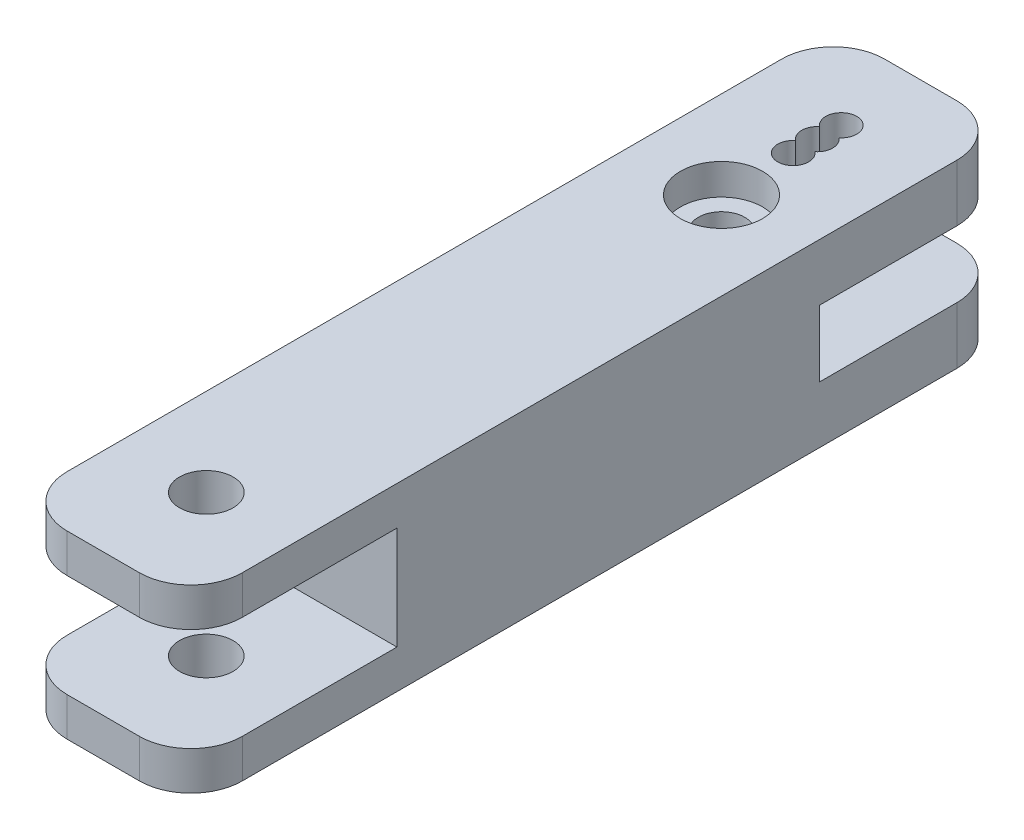
ISO-10303-21;
HEADER;
FILE_DESCRIPTION(('STEP AP214'),'2;1');
FILE_NAME('part.step','',(''),(''),'','','');
FILE_SCHEMA(('AUTOMOTIVE_DESIGN { 1 0 10303 214 1 1 1 1 }'));
ENDSEC;
DATA;
#1=APPLICATION_CONTEXT('core data for automotive mechanical design processes');
#2=APPLICATION_PROTOCOL_DEFINITION('international standard','automotive_design',2000,#1);
#3=PRODUCT_CONTEXT('',#1,'mechanical');
#4=PRODUCT('Part','Part','',(#3));
#5=PRODUCT_RELATED_PRODUCT_CATEGORY('part','',(#4));
#6=PRODUCT_DEFINITION_FORMATION('','',#4);
#7=PRODUCT_DEFINITION_CONTEXT('part definition',#1,'design');
#8=PRODUCT_DEFINITION('design','',#6,#7);
#9=PRODUCT_DEFINITION_SHAPE('','',#8);
#10=(LENGTH_UNIT() NAMED_UNIT(*) SI_UNIT(.MILLI.,.METRE.));
#11=(NAMED_UNIT(*) PLANE_ANGLE_UNIT() SI_UNIT($,.RADIAN.));
#12=(NAMED_UNIT(*) SI_UNIT($,.STERADIAN.) SOLID_ANGLE_UNIT());
#13=UNCERTAINTY_MEASURE_WITH_UNIT(LENGTH_MEASURE(1.E-05),#10,'distance_accuracy_value','');
#14=(GEOMETRIC_REPRESENTATION_CONTEXT(3) GLOBAL_UNCERTAINTY_ASSIGNED_CONTEXT((#13)) GLOBAL_UNIT_ASSIGNED_CONTEXT((#10,
#11,#12)) REPRESENTATION_CONTEXT('',''));
#15=CARTESIAN_POINT('',(0.,0.,0.));
#16=DIRECTION('',(0.,0.,1.));
#17=DIRECTION('',(1.,0.,0.));
#18=AXIS2_PLACEMENT_3D('',#15,#16,#17);
#19=CARTESIAN_POINT('',(0.,17.5,0.));
#20=DIRECTION('',(0.,0.,-1.));
#21=DIRECTION('',(-1.,0.,0.));
#22=AXIS2_PLACEMENT_3D('',#19,#20,#21);
#23=PLANE('',#22);
#24=DIRECTION('',(0.,-1.,0.));
#25=VECTOR('',#24,1.);
#26=CARTESIAN_POINT('',(12.,17.5,0.));
#27=LINE('',#26,#25);
#28=CARTESIAN_POINT('',(12.,0.,0.));
#29=VERTEX_POINT('',#28);
#30=CARTESIAN_POINT('',(12.,3.75,0.));
#31=VERTEX_POINT('',#30);
#32=EDGE_CURVE('E493',#29,#31,#27,.F.);
#33=ORIENTED_EDGE('',*,*,#32,.T.);
#34=DIRECTION('',(-1.,0.,0.));
#35=VECTOR('',#34,1.);
#36=CARTESIAN_POINT('',(0.,3.75,0.));
#37=LINE('',#36,#35);
#38=CARTESIAN_POINT('',(5.,3.75,0.));
#39=VERTEX_POINT('',#38);
#40=EDGE_CURVE('E372',#31,#39,#37,.T.);
#41=ORIENTED_EDGE('',*,*,#40,.T.);
#42=DIRECTION('',(0.,-1.,0.));
#43=VECTOR('',#42,1.);
#44=CARTESIAN_POINT('',(5.,17.5,0.));
#45=LINE('',#44,#43);
#46=CARTESIAN_POINT('',(5.,0.,0.));
#47=VERTEX_POINT('',#46);
#48=EDGE_CURVE('E497',#39,#47,#45,.T.);
#49=ORIENTED_EDGE('',*,*,#48,.T.);
#50=DIRECTION('',(1.,0.,0.));
#51=VECTOR('',#50,1.);
#52=CARTESIAN_POINT('',(0.,0.,0.));
#53=LINE('',#52,#51);
#54=EDGE_CURVE('E482',#47,#29,#53,.T.);
#55=ORIENTED_EDGE('',*,*,#54,.T.);
#56=EDGE_LOOP('',(#33,#41,#49,#55));
#57=FACE_BOUND('',#56,.T.);
#58=ADVANCED_FACE('F49',(#57),#23,.F.);
#59=CARTESIAN_POINT('',(0.,17.5,-79.3333));
#60=DIRECTION('',(0.,0.,1.));
#61=DIRECTION('',(1.,0.,0.));
#62=AXIS2_PLACEMENT_3D('',#59,#60,#61);
#63=PLANE('',#62);
#64=DIRECTION('',(0.,-1.,0.));
#65=VECTOR('',#64,1.);
#66=CARTESIAN_POINT('',(5.,17.5,-79.3333));
#67=LINE('',#66,#65);
#68=CARTESIAN_POINT('',(5.,0.,-79.3333));
#69=VERTEX_POINT('',#68);
#70=CARTESIAN_POINT('',(5.,5.525,-79.3333));
#71=VERTEX_POINT('',#70);
#72=EDGE_CURVE('E546',#69,#71,#67,.F.);
#73=ORIENTED_EDGE('',*,*,#72,.T.);
#74=DIRECTION('',(1.,0.,0.));
#75=VECTOR('',#74,1.);
#76=CARTESIAN_POINT('',(0.,5.525,-79.3333));
#77=LINE('',#76,#75);
#78=CARTESIAN_POINT('',(12.,5.525,-79.3333));
#79=VERTEX_POINT('',#78);
#80=EDGE_CURVE('E344',#71,#79,#77,.T.);
#81=ORIENTED_EDGE('',*,*,#80,.T.);
#82=DIRECTION('',(0.,-1.,0.));
#83=VECTOR('',#82,1.);
#84=CARTESIAN_POINT('',(12.,17.5,-79.3333));
#85=LINE('',#84,#83);
#86=CARTESIAN_POINT('',(12.,0.,-79.3333));
#87=VERTEX_POINT('',#86);
#88=EDGE_CURVE('E550',#79,#87,#85,.T.);
#89=ORIENTED_EDGE('',*,*,#88,.T.);
#90=DIRECTION('',(-1.,0.,0.));
#91=VECTOR('',#90,1.);
#92=CARTESIAN_POINT('',(0.,0.,-79.3333));
#93=LINE('',#92,#91);
#94=EDGE_CURVE('E466',#87,#69,#93,.T.);
#95=ORIENTED_EDGE('',*,*,#94,.T.);
#96=EDGE_LOOP('',(#73,#81,#89,#95));
#97=FACE_BOUND('',#96,.T.);
#98=ADVANCED_FACE('F626',(#97),#63,.F.);
#99=CARTESIAN_POINT('',(8.5,17.5,-10.));
#100=DIRECTION('',(0.,-1.,0.));
#101=DIRECTION('',(0.,0.,-1.));
#102=AXIS2_PLACEMENT_3D('',#99,#100,#101);
#103=CYLINDRICAL_SURFACE('',#102,2.6);
#104=CARTESIAN_POINT('',(8.5,3.75,-10.));
#105=DIRECTION('',(0.,-1.,0.));
#106=DIRECTION('',(0.,0.,-1.));
#107=AXIS2_PLACEMENT_3D('',#104,#105,#106);
#108=CIRCLE('',#107,2.6);
#109=CARTESIAN_POINT('',(8.5,3.75,-12.6));
#110=VERTEX_POINT('',#109);
#111=EDGE_CURVE('E379',#110,#110,#108,.T.);
#112=ORIENTED_EDGE('',*,*,#111,.F.);
#113=EDGE_LOOP('',(#112));
#114=FACE_BOUND('',#113,.T.);
#115=CARTESIAN_POINT('',(8.5,0.,-10.));
#116=DIRECTION('',(0.,1.,0.));
#117=DIRECTION('',(0.,0.,1.));
#118=AXIS2_PLACEMENT_3D('',#115,#116,#117);
#119=CIRCLE('',#118,2.6);
#120=CARTESIAN_POINT('',(8.5,0.,-7.4));
#121=VERTEX_POINT('',#120);
#122=EDGE_CURVE('E452',#121,#121,#119,.T.);
#123=ORIENTED_EDGE('',*,*,#122,.F.);
#124=EDGE_LOOP('',(#123));
#125=FACE_BOUND('',#124,.T.);
#126=ADVANCED_FACE('F620',(#114,#125),#103,.F.);
#127=CARTESIAN_POINT('',(8.45701186783815,17.5,-69.3332010002192));
#128=DIRECTION('',(0.,-1.,0.));
#129=DIRECTION('',(0.,0.,-1.));
#130=AXIS2_PLACEMENT_3D('',#127,#128,#129);
#131=CYLINDRICAL_SURFACE('',#130,1.50000000000001);
#132=CARTESIAN_POINT('',(8.45701186783815,5.525,-69.3332010002192));
#133=DIRECTION('',(0.,-1.,0.));
#134=DIRECTION('',(0.,0.,-1.));
#135=AXIS2_PLACEMENT_3D('',#132,#133,#134);
#136=CIRCLE('',#135,1.50000000000001);
#137=CARTESIAN_POINT('',(9.39982111565965,5.525,-70.4998675002193));
#138=VERTEX_POINT('',#137);
#139=CARTESIAN_POINT('',(9.39982111565966,5.525,-68.1665345002192));
#140=VERTEX_POINT('',#139);
#141=EDGE_CURVE('E65',#138,#140,#136,.T.);
#142=ORIENTED_EDGE('',*,*,#141,.F.);
#143=DIRECTION('',(0.,-1.,0.));
#144=VECTOR('',#143,1.);
#145=CARTESIAN_POINT('',(9.39982111565965,17.5,-70.4998675002193));
#146=LINE('',#145,#144);
#147=CARTESIAN_POINT('',(9.39982111565965,0.,-70.4998675002193));
#148=VERTEX_POINT('',#147);
#149=EDGE_CURVE('E447',#138,#148,#146,.T.);
#150=ORIENTED_EDGE('',*,*,#149,.T.);
#151=CARTESIAN_POINT('',(8.45701186783815,0.,-69.3332010002192));
#152=DIRECTION('',(0.,1.,0.));
#153=DIRECTION('',(0.,0.,1.));
#154=AXIS2_PLACEMENT_3D('',#151,#152,#153);
#155=CIRCLE('',#154,1.50000000000001);
#156=CARTESIAN_POINT('',(9.39982111565966,0.,-68.1665345002192));
#157=VERTEX_POINT('',#156);
#158=EDGE_CURVE('E400',#157,#148,#155,.T.);
#159=ORIENTED_EDGE('',*,*,#158,.F.);
#160=DIRECTION('',(0.,-1.,0.));
#161=VECTOR('',#160,1.);
#162=CARTESIAN_POINT('',(9.39982111565966,17.5,-68.1665345002192));
#163=LINE('',#162,#161);
#164=EDGE_CURVE('E418',#140,#157,#163,.T.);
#165=ORIENTED_EDGE('',*,*,#164,.F.);
#166=EDGE_LOOP('',(#142,#150,#159,#165));
#167=FACE_BOUND('',#166,.T.);
#168=ADVANCED_FACE('F595',(#167),#131,.F.);
#169=CARTESIAN_POINT('',(8.45701186783815,17.5,-71.6665340002192));
#170=DIRECTION('',(0.,-1.,0.));
#171=DIRECTION('',(0.,0.,-1.));
#172=AXIS2_PLACEMENT_3D('',#169,#170,#171);
#173=CYLINDRICAL_SURFACE('',#172,1.5);
#174=CARTESIAN_POINT('',(8.45701186783815,5.525,-71.6665340002192));
#175=DIRECTION('',(0.,-1.,0.));
#176=DIRECTION('',(0.,0.,-1.));
#177=AXIS2_PLACEMENT_3D('',#174,#175,#176);
#178=CIRCLE('',#177,1.5);
#179=CARTESIAN_POINT('',(7.51420262001665,5.525,-70.4998675002192));
#180=VERTEX_POINT('',#179);
#181=EDGE_CURVE('E357',#180,#138,#178,.T.);
#182=ORIENTED_EDGE('',*,*,#181,.F.);
#183=DIRECTION('',(0.,-1.,0.));
#184=VECTOR('',#183,1.);
#185=CARTESIAN_POINT('',(7.51420262001665,17.5,-70.4998675002192));
#186=LINE('',#185,#184);
#187=CARTESIAN_POINT('',(7.51420262001665,0.,-70.4998675002192));
#188=VERTEX_POINT('',#187);
#189=EDGE_CURVE('E442',#180,#188,#186,.T.);
#190=ORIENTED_EDGE('',*,*,#189,.T.);
#191=CARTESIAN_POINT('',(8.45701186783815,0.,-71.6665340002192));
#192=DIRECTION('',(0.,1.,0.));
#193=DIRECTION('',(0.,0.,1.));
#194=AXIS2_PLACEMENT_3D('',#191,#192,#193);
#195=CIRCLE('',#194,1.5);
#196=EDGE_CURVE('E422',#148,#188,#195,.T.);
#197=ORIENTED_EDGE('',*,*,#196,.F.);
#198=ORIENTED_EDGE('',*,*,#149,.F.);
#199=EDGE_LOOP('',(#182,#190,#197,#198));
#200=FACE_BOUND('',#199,.T.);
#201=ADVANCED_FACE('F610',(#200),#173,.F.);
#202=CARTESIAN_POINT('',(8.45701186783815,17.5,-69.3332010002192));
#203=DIRECTION('',(0.,-1.,0.));
#204=DIRECTION('',(0.,0.,-1.));
#205=AXIS2_PLACEMENT_3D('',#202,#203,#204);
#206=CYLINDRICAL_SURFACE('',#205,1.50000000000001);
#207=CARTESIAN_POINT('',(8.45701186783815,5.525,-69.3332010002192));
#208=DIRECTION('',(0.,-1.,0.));
#209=DIRECTION('',(0.,0.,-1.));
#210=AXIS2_PLACEMENT_3D('',#207,#208,#209);
#211=CIRCLE('',#210,1.50000000000001);
#212=CARTESIAN_POINT('',(7.51420262001665,5.525,-68.1665345002192));
#213=VERTEX_POINT('',#212);
#214=EDGE_CURVE('E354',#213,#180,#211,.T.);
#215=ORIENTED_EDGE('',*,*,#214,.F.);
#216=DIRECTION('',(0.,-1.,0.));
#217=VECTOR('',#216,1.);
#218=CARTESIAN_POINT('',(7.51420262001665,17.5,-68.1665345002192));
#219=LINE('',#218,#217);
#220=CARTESIAN_POINT('',(7.51420262001665,0.,-68.1665345002192));
#221=VERTEX_POINT('',#220);
#222=EDGE_CURVE('E437',#213,#221,#219,.T.);
#223=ORIENTED_EDGE('',*,*,#222,.T.);
#224=CARTESIAN_POINT('',(8.45701186783815,0.,-69.3332010002192));
#225=DIRECTION('',(0.,1.,0.));
#226=DIRECTION('',(0.,0.,1.));
#227=AXIS2_PLACEMENT_3D('',#224,#225,#226);
#228=CIRCLE('',#227,1.50000000000001);
#229=EDGE_CURVE('E426',#188,#221,#228,.T.);
#230=ORIENTED_EDGE('',*,*,#229,.F.);
#231=ORIENTED_EDGE('',*,*,#189,.F.);
#232=EDGE_LOOP('',(#215,#223,#230,#231));
#233=FACE_BOUND('',#232,.T.);
#234=ADVANCED_FACE('F605',(#233),#206,.F.);
#235=CARTESIAN_POINT('',(8.45701186783815,17.5,-66.9998680002192));
#236=DIRECTION('',(0.,-1.,0.));
#237=DIRECTION('',(0.,0.,-1.));
#238=AXIS2_PLACEMENT_3D('',#235,#236,#237);
#239=CYLINDRICAL_SURFACE('',#238,1.5);
#240=CARTESIAN_POINT('',(8.45701186783815,5.525,-66.9998680002192));
#241=DIRECTION('',(0.,-1.,0.));
#242=DIRECTION('',(0.,0.,-1.));
#243=AXIS2_PLACEMENT_3D('',#240,#241,#242);
#244=CIRCLE('',#243,1.5);
#245=EDGE_CURVE('E351',#140,#213,#244,.T.);
#246=ORIENTED_EDGE('',*,*,#245,.F.);
#247=ORIENTED_EDGE('',*,*,#164,.T.);
#248=CARTESIAN_POINT('',(8.45701186783815,0.,-66.9998680002192));
#249=DIRECTION('',(0.,1.,0.));
#250=DIRECTION('',(0.,0.,1.));
#251=AXIS2_PLACEMENT_3D('',#248,#249,#250);
#252=CIRCLE('',#251,1.5);
#253=EDGE_CURVE('E408',#221,#157,#252,.T.);
#254=ORIENTED_EDGE('',*,*,#253,.F.);
#255=ORIENTED_EDGE('',*,*,#222,.F.);
#256=EDGE_LOOP('',(#246,#247,#254,#255));
#257=FACE_BOUND('',#256,.T.);
#258=ADVANCED_FACE('F592',(#257),#239,.F.);
#259=CARTESIAN_POINT('',(5.,17.5,-5.));
#260=DIRECTION('',(0.,-1.,0.));
#261=DIRECTION('',(0.,0.,-1.));
#262=AXIS2_PLACEMENT_3D('',#259,#260,#261);
#263=CYLINDRICAL_SURFACE('',#262,5.);
#264=CARTESIAN_POINT('',(5.,3.75,-5.));
#265=DIRECTION('',(0.,-1.,0.));
#266=DIRECTION('',(0.,0.,-1.));
#267=AXIS2_PLACEMENT_3D('',#264,#265,#266);
#268=CIRCLE('',#267,5.);
#269=CARTESIAN_POINT('',(0.,3.75,-5.));
#270=VERTEX_POINT('',#269);
#271=EDGE_CURVE('E376',#270,#39,#268,.F.);
#272=ORIENTED_EDGE('',*,*,#271,.F.);
#273=DIRECTION('',(0.,-1.,0.));
#274=VECTOR('',#273,1.);
#275=CARTESIAN_POINT('',(0.,17.5,-5.));
#276=LINE('',#275,#274);
#277=CARTESIAN_POINT('',(0.,0.,-5.));
#278=VERTEX_POINT('',#277);
#279=EDGE_CURVE('E520',#278,#270,#276,.F.);
#280=ORIENTED_EDGE('',*,*,#279,.F.);
#281=CARTESIAN_POINT('',(5.,0.,-5.));
#282=DIRECTION('',(0.,-1.,0.));
#283=DIRECTION('',(0.,0.,-1.));
#284=AXIS2_PLACEMENT_3D('',#281,#282,#283);
#285=CIRCLE('',#284,5.);
#286=EDGE_CURVE('E511',#47,#278,#285,.T.);
#287=ORIENTED_EDGE('',*,*,#286,.F.);
#288=ORIENTED_EDGE('',*,*,#48,.F.);
#289=EDGE_LOOP('',(#272,#280,#287,#288));
#290=FACE_BOUND('',#289,.T.);
#291=ADVANCED_FACE('F657',(#290),#263,.T.);
#292=CARTESIAN_POINT('',(12.,17.5,-5.));
#293=DIRECTION('',(0.,-1.,0.));
#294=DIRECTION('',(0.,0.,-1.));
#295=AXIS2_PLACEMENT_3D('',#292,#293,#294);
#296=CYLINDRICAL_SURFACE('',#295,5.);
#297=CARTESIAN_POINT('',(12.,3.75,-5.));
#298=DIRECTION('',(0.,-1.,0.));
#299=DIRECTION('',(0.,0.,-1.));
#300=AXIS2_PLACEMENT_3D('',#297,#298,#299);
#301=CIRCLE('',#300,5.);
#302=CARTESIAN_POINT('',(17.,3.75,-5.));
#303=VERTEX_POINT('',#302);
#304=EDGE_CURVE('E12',#31,#303,#301,.F.);
#305=ORIENTED_EDGE('',*,*,#304,.F.);
#306=ORIENTED_EDGE('',*,*,#32,.F.);
#307=CARTESIAN_POINT('',(12.,0.,-5.));
#308=DIRECTION('',(0.,-1.,0.));
#309=DIRECTION('',(0.,0.,-1.));
#310=AXIS2_PLACEMENT_3D('',#307,#308,#309);
#311=CIRCLE('',#310,5.);
#312=CARTESIAN_POINT('',(17.,0.,-5.));
#313=VERTEX_POINT('',#312);
#314=EDGE_CURVE('E508',#313,#29,#311,.T.);
#315=ORIENTED_EDGE('',*,*,#314,.F.);
#316=DIRECTION('',(0.,-1.,0.));
#317=VECTOR('',#316,1.);
#318=CARTESIAN_POINT('',(17.,17.5,-5.));
#319=LINE('',#318,#317);
#320=EDGE_CURVE('E540',#303,#313,#319,.T.);
#321=ORIENTED_EDGE('',*,*,#320,.F.);
#322=EDGE_LOOP('',(#305,#306,#315,#321));
#323=FACE_BOUND('',#322,.T.);
#324=ADVANCED_FACE('F660',(#323),#296,.T.);
#325=CARTESIAN_POINT('',(12.,17.5,-74.3333));
#326=DIRECTION('',(0.,-1.,0.));
#327=DIRECTION('',(0.,0.,-1.));
#328=AXIS2_PLACEMENT_3D('',#325,#326,#327);
#329=CYLINDRICAL_SURFACE('',#328,5.);
#330=CARTESIAN_POINT('',(12.,5.525,-74.3333));
#331=DIRECTION('',(0.,-1.,0.));
#332=DIRECTION('',(0.,0.,-1.));
#333=AXIS2_PLACEMENT_3D('',#330,#331,#332);
#334=CIRCLE('',#333,5.);
#335=CARTESIAN_POINT('',(17.,5.525,-74.3333));
#336=VERTEX_POINT('',#335);
#337=EDGE_CURVE('E348',#336,#79,#334,.F.);
#338=ORIENTED_EDGE('',*,*,#337,.F.);
#339=DIRECTION('',(0.,-1.,0.));
#340=VECTOR('',#339,1.);
#341=CARTESIAN_POINT('',(17.,17.5,-74.3333));
#342=LINE('',#341,#340);
#343=CARTESIAN_POINT('',(17.,0.,-74.3333));
#344=VERTEX_POINT('',#343);
#345=EDGE_CURVE('E536',#344,#336,#342,.F.);
#346=ORIENTED_EDGE('',*,*,#345,.F.);
#347=CARTESIAN_POINT('',(12.,0.,-74.3333));
#348=DIRECTION('',(0.,-1.,0.));
#349=DIRECTION('',(0.,0.,-1.));
#350=AXIS2_PLACEMENT_3D('',#347,#348,#349);
#351=CIRCLE('',#350,5.);
#352=EDGE_CURVE('E505',#87,#344,#351,.T.);
#353=ORIENTED_EDGE('',*,*,#352,.F.);
#354=ORIENTED_EDGE('',*,*,#88,.F.);
#355=EDGE_LOOP('',(#338,#346,#353,#354));
#356=FACE_BOUND('',#355,.T.);
#357=ADVANCED_FACE('F663',(#356),#329,.T.);
#358=CARTESIAN_POINT('',(5.,17.5,-74.3333));
#359=DIRECTION('',(0.,-1.,0.));
#360=DIRECTION('',(0.,0.,-1.));
#361=AXIS2_PLACEMENT_3D('',#358,#359,#360);
#362=CYLINDRICAL_SURFACE('',#361,5.);
#363=CARTESIAN_POINT('',(5.,5.525,-74.3333));
#364=DIRECTION('',(0.,-1.,0.));
#365=DIRECTION('',(0.,0.,-1.));
#366=AXIS2_PLACEMENT_3D('',#363,#364,#365);
#367=CIRCLE('',#366,5.);
#368=CARTESIAN_POINT('',(0.,5.525,-74.3333));
#369=VERTEX_POINT('',#368);
#370=EDGE_CURVE('E341',#71,#369,#367,.F.);
#371=ORIENTED_EDGE('',*,*,#370,.F.);
#372=ORIENTED_EDGE('',*,*,#72,.F.);
#373=CARTESIAN_POINT('',(5.,0.,-74.3333));
#374=DIRECTION('',(0.,-1.,0.));
#375=DIRECTION('',(0.,0.,-1.));
#376=AXIS2_PLACEMENT_3D('',#373,#374,#375);
#377=CIRCLE('',#376,5.);
#378=CARTESIAN_POINT('',(0.,0.,-74.3333));
#379=VERTEX_POINT('',#378);
#380=EDGE_CURVE('E502',#379,#69,#377,.T.);
#381=ORIENTED_EDGE('',*,*,#380,.F.);
#382=DIRECTION('',(0.,-1.,0.));
#383=VECTOR('',#382,1.);
#384=CARTESIAN_POINT('',(0.,17.5,-74.3333));
#385=LINE('',#384,#383);
#386=EDGE_CURVE('E514',#369,#379,#385,.T.);
#387=ORIENTED_EDGE('',*,*,#386,.F.);
#388=EDGE_LOOP('',(#371,#372,#381,#387));
#389=FACE_BOUND('',#388,.T.);
#390=ADVANCED_FACE('F669',(#389),#362,.T.);
#391=CARTESIAN_POINT('',(8.5,17.5,-60.));
#392=DIRECTION('',(0.,-1.,0.));
#393=DIRECTION('',(0.,0.,-1.));
#394=AXIS2_PLACEMENT_3D('',#391,#392,#393);
#395=CYLINDRICAL_SURFACE('',#394,3.985);
#396=CARTESIAN_POINT('',(8.5,17.5,-60.));
#397=DIRECTION('',(0.,1.,0.));
#398=DIRECTION('',(0.,0.,1.));
#399=AXIS2_PLACEMENT_3D('',#396,#397,#398);
#400=CIRCLE('',#399,3.985);
#401=CARTESIAN_POINT('',(8.5,17.5,-56.015));
#402=VERTEX_POINT('',#401);
#403=EDGE_CURVE('E396',#402,#402,#400,.T.);
#404=ORIENTED_EDGE('',*,*,#403,.T.);
#405=EDGE_LOOP('',(#404));
#406=FACE_BOUND('',#405,.T.);
#407=CARTESIAN_POINT('',(8.5,14.5,-60.));
#408=DIRECTION('',(0.,-1.,0.));
#409=DIRECTION('',(0.,0.,-1.));
#410=AXIS2_PLACEMENT_3D('',#407,#408,#409);
#411=CIRCLE('',#410,3.98499999999999);
#412=CARTESIAN_POINT('',(8.5,14.5,-63.985));
#413=VERTEX_POINT('',#412);
#414=EDGE_CURVE('E387',#413,#413,#411,.T.);
#415=ORIENTED_EDGE('',*,*,#414,.T.);
#416=EDGE_LOOP('',(#415));
#417=FACE_BOUND('',#416,.T.);
#418=ADVANCED_FACE('F676',(#406,#417),#395,.F.);
#419=CARTESIAN_POINT('',(0.,17.5,0.));
#420=DIRECTION('',(0.,-1.,0.));
#421=DIRECTION('',(0.,0.,-1.));
#422=AXIS2_PLACEMENT_3D('',#419,#420,#421);
#423=PLANE('',#422);
#424=CARTESIAN_POINT('',(8.5,17.5,-10.));
#425=DIRECTION('',(0.,1.,0.));
#426=DIRECTION('',(0.,0.,1.));
#427=AXIS2_PLACEMENT_3D('',#424,#425,#426);
#428=CIRCLE('',#427,2.6);
#429=CARTESIAN_POINT('',(8.5,17.5,-7.4));
#430=VERTEX_POINT('',#429);
#431=EDGE_CURVE('E453',#430,#430,#428,.T.);
#432=ORIENTED_EDGE('',*,*,#431,.F.);
#433=EDGE_LOOP('',(#432));
#434=FACE_BOUND('',#433,.T.);
#435=DIRECTION('',(0.,0.,1.));
#436=VECTOR('',#435,1.);
#437=CARTESIAN_POINT('',(0.,17.5,0.));
#438=LINE('',#437,#436);
#439=CARTESIAN_POINT('',(0.,17.5,-74.3333));
#440=VERTEX_POINT('',#439);
#441=CARTESIAN_POINT('',(0.,17.5,-5.));
#442=VERTEX_POINT('',#441);
#443=EDGE_CURVE('E461',#440,#442,#438,.T.);
#444=ORIENTED_EDGE('',*,*,#443,.T.);
#445=CARTESIAN_POINT('',(5.,17.5,-5.));
#446=DIRECTION('',(0.,-1.,0.));
#447=DIRECTION('',(0.,0.,-1.));
#448=AXIS2_PLACEMENT_3D('',#445,#446,#447);
#449=CIRCLE('',#448,5.);
#450=CARTESIAN_POINT('',(5.,17.5,0.));
#451=VERTEX_POINT('',#450);
#452=EDGE_CURVE('E532',#442,#451,#449,.F.);
#453=ORIENTED_EDGE('',*,*,#452,.T.);
#454=DIRECTION('',(1.,0.,0.));
#455=VECTOR('',#454,1.);
#456=CARTESIAN_POINT('',(0.,17.5,0.));
#457=LINE('',#456,#455);
#458=CARTESIAN_POINT('',(12.,17.5,0.));
#459=VERTEX_POINT('',#458);
#460=EDGE_CURVE('E465',#451,#459,#457,.T.);
#461=ORIENTED_EDGE('',*,*,#460,.T.);
#462=CARTESIAN_POINT('',(12.,17.5,-5.));
#463=DIRECTION('',(0.,-1.,0.));
#464=DIRECTION('',(0.,0.,-1.));
#465=AXIS2_PLACEMENT_3D('',#462,#463,#464);
#466=CIRCLE('',#465,5.);
#467=CARTESIAN_POINT('',(17.,17.5,-5.));
#468=VERTEX_POINT('',#467);
#469=EDGE_CURVE('E529',#459,#468,#466,.F.);
#470=ORIENTED_EDGE('',*,*,#469,.T.);
#471=DIRECTION('',(0.,0.,-1.));
#472=VECTOR('',#471,1.);
#473=CARTESIAN_POINT('',(17.,17.5,0.));
#474=LINE('',#473,#472);
#475=CARTESIAN_POINT('',(17.,17.5,-74.3333));
#476=VERTEX_POINT('',#475);
#477=EDGE_CURVE('E470',#468,#476,#474,.T.);
#478=ORIENTED_EDGE('',*,*,#477,.T.);
#479=CARTESIAN_POINT('',(12.,17.5,-74.3333));
#480=DIRECTION('',(0.,-1.,0.));
#481=DIRECTION('',(0.,0.,-1.));
#482=AXIS2_PLACEMENT_3D('',#479,#480,#481);
#483=CIRCLE('',#482,5.);
#484=CARTESIAN_POINT('',(12.,17.5,-79.3333));
#485=VERTEX_POINT('',#484);
#486=EDGE_CURVE('E526',#476,#485,#483,.F.);
#487=ORIENTED_EDGE('',*,*,#486,.T.);
#488=DIRECTION('',(-1.,0.,0.));
#489=VECTOR('',#488,1.);
#490=CARTESIAN_POINT('',(0.,17.5,-79.3333));
#491=LINE('',#490,#489);
#492=CARTESIAN_POINT('',(5.,17.5,-79.3333));
#493=VERTEX_POINT('',#492);
#494=EDGE_CURVE('E474',#485,#493,#491,.T.);
#495=ORIENTED_EDGE('',*,*,#494,.T.);
#496=CARTESIAN_POINT('',(5.,17.5,-74.3333));
#497=DIRECTION('',(0.,-1.,0.));
#498=DIRECTION('',(0.,0.,-1.));
#499=AXIS2_PLACEMENT_3D('',#496,#497,#498);
#500=CIRCLE('',#499,5.);
#501=EDGE_CURVE('E523',#493,#440,#500,.F.);
#502=ORIENTED_EDGE('',*,*,#501,.T.);
#503=EDGE_LOOP('',(#444,#453,#461,#470,#478,#487,#495,#502));
#504=FACE_BOUND('',#503,.T.);
#505=CARTESIAN_POINT('',(8.45701186783815,17.5,-69.3332010002192));
#506=DIRECTION('',(0.,1.,0.));
#507=DIRECTION('',(0.,0.,1.));
#508=AXIS2_PLACEMENT_3D('',#505,#506,#507);
#509=CIRCLE('',#508,1.50000000000001);
#510=CARTESIAN_POINT('',(9.39982111565966,17.5,-68.1665345002192));
#511=VERTEX_POINT('',#510);
#512=CARTESIAN_POINT('',(9.39982111565965,17.5,-70.4998675002193));
#513=VERTEX_POINT('',#512);
#514=EDGE_CURVE('E404',#511,#513,#509,.T.);
#515=ORIENTED_EDGE('',*,*,#514,.F.);
#516=CARTESIAN_POINT('',(8.45701186783815,17.5,-66.9998680002192));
#517=DIRECTION('',(0.,1.,0.));
#518=DIRECTION('',(0.,0.,1.));
#519=AXIS2_PLACEMENT_3D('',#516,#517,#518);
#520=CIRCLE('',#519,1.5);
#521=CARTESIAN_POINT('',(7.51420262001665,17.5,-68.1665345002192));
#522=VERTEX_POINT('',#521);
#523=EDGE_CURVE('E415',#522,#511,#520,.T.);
#524=ORIENTED_EDGE('',*,*,#523,.F.);
#525=CARTESIAN_POINT('',(8.45701186783815,17.5,-69.3332010002192));
#526=DIRECTION('',(0.,1.,0.));
#527=DIRECTION('',(0.,0.,1.));
#528=AXIS2_PLACEMENT_3D('',#525,#526,#527);
#529=CIRCLE('',#528,1.50000000000001);
#530=CARTESIAN_POINT('',(7.51420262001665,17.5,-70.4998675002192));
#531=VERTEX_POINT('',#530);
#532=EDGE_CURVE('E411',#531,#522,#529,.T.);
#533=ORIENTED_EDGE('',*,*,#532,.F.);
#534=CARTESIAN_POINT('',(8.45701186783815,17.5,-71.6665340002192));
#535=DIRECTION('',(0.,1.,0.));
#536=DIRECTION('',(0.,0.,1.));
#537=AXIS2_PLACEMENT_3D('',#534,#535,#536);
#538=CIRCLE('',#537,1.5);
#539=EDGE_CURVE('E407',#513,#531,#538,.T.);
#540=ORIENTED_EDGE('',*,*,#539,.F.);
#541=EDGE_LOOP('',(#515,#524,#533,#540));
#542=FACE_BOUND('',#541,.T.);
#543=ORIENTED_EDGE('',*,*,#403,.F.);
#544=EDGE_LOOP('',(#543));
#545=FACE_BOUND('',#544,.T.);
#546=ADVANCED_FACE('F649',(#434,#504,#542,#545),#423,.F.);
#547=CARTESIAN_POINT('',(0.,0.,0.));
#548=DIRECTION('',(0.,-1.,0.));
#549=DIRECTION('',(0.,0.,-1.));
#550=AXIS2_PLACEMENT_3D('',#547,#548,#549);
#551=PLANE('',#550);
#552=ORIENTED_EDGE('',*,*,#253,.T.);
#553=ORIENTED_EDGE('',*,*,#158,.T.);
#554=ORIENTED_EDGE('',*,*,#196,.T.);
#555=ORIENTED_EDGE('',*,*,#229,.T.);
#556=EDGE_LOOP('',(#552,#553,#554,#555));
#557=FACE_BOUND('',#556,.T.);
#558=ORIENTED_EDGE('',*,*,#122,.T.);
#559=EDGE_LOOP('',(#558));
#560=FACE_BOUND('',#559,.T.);
#561=ORIENTED_EDGE('',*,*,#54,.F.);
#562=ORIENTED_EDGE('',*,*,#286,.T.);
#563=DIRECTION('',(0.,0.,1.));
#564=VECTOR('',#563,1.);
#565=CARTESIAN_POINT('',(0.,0.,0.));
#566=LINE('',#565,#564);
#567=EDGE_CURVE('E457',#379,#278,#566,.T.);
#568=ORIENTED_EDGE('',*,*,#567,.F.);
#569=ORIENTED_EDGE('',*,*,#380,.T.);
#570=ORIENTED_EDGE('',*,*,#94,.F.);
#571=ORIENTED_EDGE('',*,*,#352,.T.);
#572=DIRECTION('',(0.,0.,-1.));
#573=VECTOR('',#572,1.);
#574=CARTESIAN_POINT('',(17.,0.,0.));
#575=LINE('',#574,#573);
#576=EDGE_CURVE('E486',#313,#344,#575,.T.);
#577=ORIENTED_EDGE('',*,*,#576,.F.);
#578=ORIENTED_EDGE('',*,*,#314,.T.);
#579=EDGE_LOOP('',(#561,#562,#568,#569,#570,#571,#577,#578));
#580=FACE_BOUND('',#579,.T.);
#581=CARTESIAN_POINT('',(8.5,0.,-60.));
#582=DIRECTION('',(0.,1.,0.));
#583=DIRECTION('',(0.,0.,1.));
#584=AXIS2_PLACEMENT_3D('',#581,#582,#583);
#585=CIRCLE('',#584,3.985);
#586=CARTESIAN_POINT('',(8.5,0.,-56.015));
#587=VERTEX_POINT('',#586);
#588=EDGE_CURVE('E395',#587,#587,#585,.T.);
#589=ORIENTED_EDGE('',*,*,#588,.T.);
#590=EDGE_LOOP('',(#589));
#591=FACE_BOUND('',#590,.T.);
#592=ADVANCED_FACE('F599',(#557,#560,#580,#591),#551,.T.);
#593=CARTESIAN_POINT('',(0.,17.5,0.));
#594=DIRECTION('',(1.,0.,0.));
#595=DIRECTION('',(0.,0.,-1.));
#596=AXIS2_PLACEMENT_3D('',#593,#594,#595);
#597=PLANE('',#596);
#598=ORIENTED_EDGE('',*,*,#279,.T.);
#599=DIRECTION('',(0.,0.,-1.));
#600=VECTOR('',#599,1.);
#601=CARTESIAN_POINT('',(0.,3.75,20.));
#602=LINE('',#601,#600);
#603=CARTESIAN_POINT('',(0.,3.75,-20.));
#604=VERTEX_POINT('',#603);
#605=EDGE_CURVE('E259',#270,#604,#602,.T.);
#606=ORIENTED_EDGE('',*,*,#605,.T.);
#607=DIRECTION('',(0.,1.,0.));
#608=VECTOR('',#607,1.);
#609=CARTESIAN_POINT('',(0.,13.75,-20.));
#610=LINE('',#609,#608);
#611=CARTESIAN_POINT('',(0.,13.75,-20.));
#612=VERTEX_POINT('',#611);
#613=EDGE_CURVE('E251',#604,#612,#610,.T.);
#614=ORIENTED_EDGE('',*,*,#613,.T.);
#615=DIRECTION('',(0.,0.,1.));
#616=VECTOR('',#615,1.);
#617=CARTESIAN_POINT('',(0.,13.75,20.));
#618=LINE('',#617,#616);
#619=CARTESIAN_POINT('',(0.,13.75,-5.));
#620=VERTEX_POINT('',#619);
#621=EDGE_CURVE('E262',#612,#620,#618,.T.);
#622=ORIENTED_EDGE('',*,*,#621,.T.);
#623=EDGE_CURVE('E519',#620,#442,#276,.F.);
#624=ORIENTED_EDGE('',*,*,#623,.T.);
#625=ORIENTED_EDGE('',*,*,#443,.F.);
#626=CARTESIAN_POINT('',(0.,11.975,-74.3333));
#627=VERTEX_POINT('',#626);
#628=EDGE_CURVE('E515',#440,#627,#385,.T.);
#629=ORIENTED_EDGE('',*,*,#628,.T.);
#630=DIRECTION('',(0.,0.,1.));
#631=VECTOR('',#630,1.);
#632=CARTESIAN_POINT('',(0.,11.975,-60.9998680002192));
#633=LINE('',#632,#631);
#634=CARTESIAN_POINT('',(0.,11.975,-60.9998680002192));
#635=VERTEX_POINT('',#634);
#636=EDGE_CURVE('E304',#627,#635,#633,.T.);
#637=ORIENTED_EDGE('',*,*,#636,.T.);
#638=DIRECTION('',(0.,-1.,0.));
#639=VECTOR('',#638,1.);
#640=CARTESIAN_POINT('',(0.,11.975,-60.9998680002192));
#641=LINE('',#640,#639);
#642=CARTESIAN_POINT('',(0.,5.525,-60.9998680002192));
#643=VERTEX_POINT('',#642);
#644=EDGE_CURVE('E314',#635,#643,#641,.T.);
#645=ORIENTED_EDGE('',*,*,#644,.T.);
#646=DIRECTION('',(0.,0.,-1.));
#647=VECTOR('',#646,1.);
#648=CARTESIAN_POINT('',(0.,5.525,-60.9998680002192));
#649=LINE('',#648,#647);
#650=EDGE_CURVE('E293',#643,#369,#649,.T.);
#651=ORIENTED_EDGE('',*,*,#650,.T.);
#652=ORIENTED_EDGE('',*,*,#386,.T.);
#653=ORIENTED_EDGE('',*,*,#567,.T.);
#654=EDGE_LOOP('',(#598,#606,#614,#622,#624,#625,#629,#637,#645,#651,#652,#653));
#655=FACE_BOUND('',#654,.T.);
#656=ADVANCED_FACE('F271',(#655),#597,.F.);
#657=CARTESIAN_POINT('',(5.,13.75,0.));
#658=VERTEX_POINT('',#657);
#659=EDGE_CURVE('E498',#451,#658,#45,.T.);
#660=ORIENTED_EDGE('',*,*,#659,.T.);
#661=DIRECTION('',(1.,0.,0.));
#662=VECTOR('',#661,1.);
#663=CARTESIAN_POINT('',(0.,13.75,0.));
#664=LINE('',#663,#662);
#665=CARTESIAN_POINT('',(12.,13.75,0.));
#666=VERTEX_POINT('',#665);
#667=EDGE_CURVE('E362',#658,#666,#664,.T.);
#668=ORIENTED_EDGE('',*,*,#667,.T.);
#669=EDGE_CURVE('E478',#666,#459,#27,.F.);
#670=ORIENTED_EDGE('',*,*,#669,.T.);
#671=ORIENTED_EDGE('',*,*,#460,.F.);
#672=EDGE_LOOP('',(#660,#668,#670,#671));
#673=FACE_BOUND('',#672,.T.);
#674=ADVANCED_FACE('F577',(#673),#23,.F.);
#675=CARTESIAN_POINT('',(17.,17.5,0.));
#676=DIRECTION('',(-1.,0.,0.));
#677=DIRECTION('',(0.,0.,1.));
#678=AXIS2_PLACEMENT_3D('',#675,#676,#677);
#679=PLANE('',#678);
#680=DIRECTION('',(0.,1.,0.));
#681=VECTOR('',#680,1.);
#682=CARTESIAN_POINT('',(17.,13.75,-20.));
#683=LINE('',#682,#681);
#684=CARTESIAN_POINT('',(17.,3.75,-20.));
#685=VERTEX_POINT('',#684);
#686=CARTESIAN_POINT('',(17.,13.75,-20.));
#687=VERTEX_POINT('',#686);
#688=EDGE_CURVE('E254',#685,#687,#683,.T.);
#689=ORIENTED_EDGE('',*,*,#688,.F.);
#690=DIRECTION('',(0.,0.,-1.));
#691=VECTOR('',#690,1.);
#692=CARTESIAN_POINT('',(17.,3.75,20.));
#693=LINE('',#692,#691);
#694=EDGE_CURVE('E273',#303,#685,#693,.T.);
#695=ORIENTED_EDGE('',*,*,#694,.F.);
#696=ORIENTED_EDGE('',*,*,#320,.T.);
#697=ORIENTED_EDGE('',*,*,#576,.T.);
#698=ORIENTED_EDGE('',*,*,#345,.T.);
#699=DIRECTION('',(0.,0.,-1.));
#700=VECTOR('',#699,1.);
#701=CARTESIAN_POINT('',(17.,5.525,-60.9998680002192));
#702=LINE('',#701,#700);
#703=CARTESIAN_POINT('',(17.,5.525,-60.9998680002192));
#704=VERTEX_POINT('',#703);
#705=EDGE_CURVE('E300',#704,#336,#702,.T.);
#706=ORIENTED_EDGE('',*,*,#705,.F.);
#707=DIRECTION('',(0.,-1.,0.));
#708=VECTOR('',#707,1.);
#709=CARTESIAN_POINT('',(17.,11.975,-60.9998680002192));
#710=LINE('',#709,#708);
#711=CARTESIAN_POINT('',(17.,11.975,-60.9998680002192));
#712=VERTEX_POINT('',#711);
#713=EDGE_CURVE('E303',#712,#704,#710,.T.);
#714=ORIENTED_EDGE('',*,*,#713,.F.);
#715=DIRECTION('',(0.,0.,1.));
#716=VECTOR('',#715,1.);
#717=CARTESIAN_POINT('',(17.,11.975,-60.9998680002192));
#718=LINE('',#717,#716);
#719=CARTESIAN_POINT('',(17.,11.975,-74.3333));
#720=VERTEX_POINT('',#719);
#721=EDGE_CURVE('E283',#720,#712,#718,.T.);
#722=ORIENTED_EDGE('',*,*,#721,.F.);
#723=EDGE_CURVE('E535',#720,#476,#342,.F.);
#724=ORIENTED_EDGE('',*,*,#723,.T.);
#725=ORIENTED_EDGE('',*,*,#477,.F.);
#726=CARTESIAN_POINT('',(17.,13.75,-5.));
#727=VERTEX_POINT('',#726);
#728=EDGE_CURVE('E541',#468,#727,#319,.T.);
#729=ORIENTED_EDGE('',*,*,#728,.T.);
#730=DIRECTION('',(0.,0.,1.));
#731=VECTOR('',#730,1.);
#732=CARTESIAN_POINT('',(17.,13.75,20.));
#733=LINE('',#732,#731);
#734=EDGE_CURVE('E276',#687,#727,#733,.T.);
#735=ORIENTED_EDGE('',*,*,#734,.F.);
#736=EDGE_LOOP('',(#689,#695,#696,#697,#698,#706,#714,#722,#724,#725,#729,#735));
#737=FACE_BOUND('',#736,.T.);
#738=ADVANCED_FACE('F639',(#737),#679,.F.);
#739=CARTESIAN_POINT('',(12.,11.975,-79.3333));
#740=VERTEX_POINT('',#739);
#741=EDGE_CURVE('E551',#485,#740,#85,.T.);
#742=ORIENTED_EDGE('',*,*,#741,.T.);
#743=DIRECTION('',(-1.,0.,0.));
#744=VECTOR('',#743,1.);
#745=CARTESIAN_POINT('',(0.,11.975,-79.3333));
#746=LINE('',#745,#744);
#747=CARTESIAN_POINT('',(5.,11.975,-79.3333));
#748=VERTEX_POINT('',#747);
#749=EDGE_CURVE('E323',#740,#748,#746,.T.);
#750=ORIENTED_EDGE('',*,*,#749,.T.);
#751=EDGE_CURVE('E545',#748,#493,#67,.F.);
#752=ORIENTED_EDGE('',*,*,#751,.T.);
#753=ORIENTED_EDGE('',*,*,#494,.F.);
#754=EDGE_LOOP('',(#742,#750,#752,#753));
#755=FACE_BOUND('',#754,.T.);
#756=ADVANCED_FACE('F635',(#755),#63,.F.);
#757=CARTESIAN_POINT('',(8.5,13.75,-10.));
#758=DIRECTION('',(0.,1.,0.));
#759=DIRECTION('',(0.,0.,1.));
#760=AXIS2_PLACEMENT_3D('',#757,#758,#759);
#761=CIRCLE('',#760,2.6);
#762=CARTESIAN_POINT('',(8.5,13.75,-7.4));
#763=VERTEX_POINT('',#762);
#764=EDGE_CURVE('E368',#763,#763,#761,.T.);
#765=ORIENTED_EDGE('',*,*,#764,.F.);
#766=EDGE_LOOP('',(#765));
#767=FACE_BOUND('',#766,.T.);
#768=ORIENTED_EDGE('',*,*,#431,.T.);
#769=EDGE_LOOP('',(#768));
#770=FACE_BOUND('',#769,.T.);
#771=ADVANCED_FACE('F746',(#767,#770),#103,.F.);
#772=CARTESIAN_POINT('',(8.45701186783815,11.975,-69.3332010002192));
#773=DIRECTION('',(0.,1.,0.));
#774=DIRECTION('',(0.,0.,1.));
#775=AXIS2_PLACEMENT_3D('',#772,#773,#774);
#776=CIRCLE('',#775,1.50000000000001);
#777=CARTESIAN_POINT('',(9.39982111565966,11.975,-68.1665345002192));
#778=VERTEX_POINT('',#777);
#779=CARTESIAN_POINT('',(9.39982111565965,11.975,-70.4998675002193));
#780=VERTEX_POINT('',#779);
#781=EDGE_CURVE('E338',#778,#780,#776,.T.);
#782=ORIENTED_EDGE('',*,*,#781,.F.);
#783=EDGE_CURVE('E433',#511,#778,#163,.T.);
#784=ORIENTED_EDGE('',*,*,#783,.F.);
#785=ORIENTED_EDGE('',*,*,#514,.T.);
#786=EDGE_CURVE('E448',#513,#780,#146,.T.);
#787=ORIENTED_EDGE('',*,*,#786,.T.);
#788=EDGE_LOOP('',(#782,#784,#785,#787));
#789=FACE_BOUND('',#788,.T.);
#790=ADVANCED_FACE('F622',(#789),#131,.F.);
#791=CARTESIAN_POINT('',(8.45701186783815,11.975,-71.6665340002192));
#792=DIRECTION('',(0.,1.,0.));
#793=DIRECTION('',(0.,0.,1.));
#794=AXIS2_PLACEMENT_3D('',#791,#792,#793);
#795=CIRCLE('',#794,1.5);
#796=CARTESIAN_POINT('',(7.51420262001665,11.975,-70.4998675002192));
#797=VERTEX_POINT('',#796);
#798=EDGE_CURVE('E335',#780,#797,#795,.T.);
#799=ORIENTED_EDGE('',*,*,#798,.F.);
#800=ORIENTED_EDGE('',*,*,#786,.F.);
#801=ORIENTED_EDGE('',*,*,#539,.T.);
#802=EDGE_CURVE('E443',#531,#797,#186,.T.);
#803=ORIENTED_EDGE('',*,*,#802,.T.);
#804=EDGE_LOOP('',(#799,#800,#801,#803));
#805=FACE_BOUND('',#804,.T.);
#806=ADVANCED_FACE('F613',(#805),#173,.F.);
#807=CARTESIAN_POINT('',(8.45701186783815,11.975,-69.3332010002192));
#808=DIRECTION('',(0.,1.,0.));
#809=DIRECTION('',(0.,0.,1.));
#810=AXIS2_PLACEMENT_3D('',#807,#808,#809);
#811=CIRCLE('',#810,1.50000000000001);
#812=CARTESIAN_POINT('',(7.51420262001665,11.975,-68.1665345002192));
#813=VERTEX_POINT('',#812);
#814=EDGE_CURVE('E73',#797,#813,#811,.T.);
#815=ORIENTED_EDGE('',*,*,#814,.F.);
#816=ORIENTED_EDGE('',*,*,#802,.F.);
#817=ORIENTED_EDGE('',*,*,#532,.T.);
#818=EDGE_CURVE('E438',#522,#813,#219,.T.);
#819=ORIENTED_EDGE('',*,*,#818,.T.);
#820=EDGE_LOOP('',(#815,#816,#817,#819));
#821=FACE_BOUND('',#820,.T.);
#822=ADVANCED_FACE('F619',(#821),#206,.F.);
#823=CARTESIAN_POINT('',(8.45701186783815,11.975,-66.9998680002192));
#824=DIRECTION('',(0.,1.,0.));
#825=DIRECTION('',(0.,0.,1.));
#826=AXIS2_PLACEMENT_3D('',#823,#824,#825);
#827=CIRCLE('',#826,1.5);
#828=EDGE_CURVE('E330',#813,#778,#827,.T.);
#829=ORIENTED_EDGE('',*,*,#828,.F.);
#830=ORIENTED_EDGE('',*,*,#818,.F.);
#831=ORIENTED_EDGE('',*,*,#523,.T.);
#832=ORIENTED_EDGE('',*,*,#783,.T.);
#833=EDGE_LOOP('',(#829,#830,#831,#832));
#834=FACE_BOUND('',#833,.T.);
#835=ADVANCED_FACE('F765',(#834),#239,.F.);
#836=CARTESIAN_POINT('',(8.5,3.,-60.));
#837=DIRECTION('',(0.,-1.,0.));
#838=DIRECTION('',(0.,0.,-1.));
#839=AXIS2_PLACEMENT_3D('',#836,#837,#838);
#840=CIRCLE('',#839,3.985);
#841=CARTESIAN_POINT('',(8.5,3.,-63.985));
#842=VERTEX_POINT('',#841);
#843=EDGE_CURVE('E555',#842,#842,#840,.T.);
#844=ORIENTED_EDGE('',*,*,#843,.F.);
#845=EDGE_LOOP('',(#844));
#846=FACE_BOUND('',#845,.T.);
#847=ORIENTED_EDGE('',*,*,#588,.F.);
#848=EDGE_LOOP('',(#847));
#849=FACE_BOUND('',#848,.T.);
#850=ADVANCED_FACE('F655',(#846,#849),#395,.F.);
#851=CARTESIAN_POINT('',(5.,13.75,-5.));
#852=DIRECTION('',(0.,1.,0.));
#853=DIRECTION('',(0.,0.,1.));
#854=AXIS2_PLACEMENT_3D('',#851,#852,#853);
#855=CIRCLE('',#854,5.);
#856=EDGE_CURVE('E265',#658,#620,#855,.F.);
#857=ORIENTED_EDGE('',*,*,#856,.F.);
#858=ORIENTED_EDGE('',*,*,#659,.F.);
#859=ORIENTED_EDGE('',*,*,#452,.F.);
#860=ORIENTED_EDGE('',*,*,#623,.F.);
#861=EDGE_LOOP('',(#857,#858,#859,#860));
#862=FACE_BOUND('',#861,.T.);
#863=ADVANCED_FACE('F652',(#862),#263,.T.);
#864=CARTESIAN_POINT('',(12.,13.75,-5.));
#865=DIRECTION('',(0.,1.,0.));
#866=DIRECTION('',(0.,0.,1.));
#867=AXIS2_PLACEMENT_3D('',#864,#865,#866);
#868=CIRCLE('',#867,5.);
#869=EDGE_CURVE('E58',#727,#666,#868,.F.);
#870=ORIENTED_EDGE('',*,*,#869,.F.);
#871=ORIENTED_EDGE('',*,*,#728,.F.);
#872=ORIENTED_EDGE('',*,*,#469,.F.);
#873=ORIENTED_EDGE('',*,*,#669,.F.);
#874=EDGE_LOOP('',(#870,#871,#872,#873));
#875=FACE_BOUND('',#874,.T.);
#876=ADVANCED_FACE('F581',(#875),#296,.T.);
#877=CARTESIAN_POINT('',(12.,11.975,-74.3333));
#878=DIRECTION('',(0.,1.,0.));
#879=DIRECTION('',(0.,0.,1.));
#880=AXIS2_PLACEMENT_3D('',#877,#878,#879);
#881=CIRCLE('',#880,5.);
#882=EDGE_CURVE('E327',#740,#720,#881,.F.);
#883=ORIENTED_EDGE('',*,*,#882,.F.);
#884=ORIENTED_EDGE('',*,*,#741,.F.);
#885=ORIENTED_EDGE('',*,*,#486,.F.);
#886=ORIENTED_EDGE('',*,*,#723,.F.);
#887=EDGE_LOOP('',(#883,#884,#885,#886));
#888=FACE_BOUND('',#887,.T.);
#889=ADVANCED_FACE('F659',(#888),#329,.T.);
#890=CARTESIAN_POINT('',(5.,11.975,-74.3333));
#891=DIRECTION('',(0.,1.,0.));
#892=DIRECTION('',(0.,0.,1.));
#893=AXIS2_PLACEMENT_3D('',#890,#891,#892);
#894=CIRCLE('',#893,5.);
#895=EDGE_CURVE('E287',#627,#748,#894,.F.);
#896=ORIENTED_EDGE('',*,*,#895,.F.);
#897=ORIENTED_EDGE('',*,*,#628,.F.);
#898=ORIENTED_EDGE('',*,*,#501,.F.);
#899=ORIENTED_EDGE('',*,*,#751,.F.);
#900=EDGE_LOOP('',(#896,#897,#898,#899));
#901=FACE_BOUND('',#900,.T.);
#902=ADVANCED_FACE('F51',(#901),#362,.T.);
#903=CARTESIAN_POINT('',(8.5,28.7712820921136,-60.));
#904=DIRECTION('',(0.,-1.,0.));
#905=DIRECTION('',(0.,0.,-1.));
#906=AXIS2_PLACEMENT_3D('',#903,#904,#905);
#907=CYLINDRICAL_SURFACE('',#906,2.25);
#908=CARTESIAN_POINT('',(8.5,5.525,-60.));
#909=DIRECTION('',(0.,-1.,0.));
#910=DIRECTION('',(0.,0.,-1.));
#911=AXIS2_PLACEMENT_3D('',#908,#909,#910);
#912=CIRCLE('',#911,2.25);
#913=CARTESIAN_POINT('',(6.48437007808039,5.525,-60.9998680002192));
#914=VERTEX_POINT('',#913);
#915=CARTESIAN_POINT('',(10.5156299219196,5.525,-60.9998680002192));
#916=VERTEX_POINT('',#915);
#917=EDGE_CURVE('E569',#914,#916,#912,.T.);
#918=ORIENTED_EDGE('',*,*,#917,.F.);
#919=DIRECTION('',(0.,-1.,0.));
#920=VECTOR('',#919,1.);
#921=CARTESIAN_POINT('',(6.48437007808039,28.7712820921136,-60.9998680002192));
#922=LINE('',#921,#920);
#923=CARTESIAN_POINT('',(6.4843700780804,11.975,-60.9998680002192));
#924=VERTEX_POINT('',#923);
#925=EDGE_CURVE('E566',#924,#914,#922,.T.);
#926=ORIENTED_EDGE('',*,*,#925,.F.);
#927=CARTESIAN_POINT('',(8.5,11.975,-60.));
#928=DIRECTION('',(0.,1.,0.));
#929=DIRECTION('',(0.,0.,1.));
#930=AXIS2_PLACEMENT_3D('',#927,#928,#929);
#931=CIRCLE('',#930,2.25);
#932=CARTESIAN_POINT('',(10.5156299219196,11.975,-60.9998680002192));
#933=VERTEX_POINT('',#932);
#934=EDGE_CURVE('E559',#933,#924,#931,.T.);
#935=ORIENTED_EDGE('',*,*,#934,.F.);
#936=DIRECTION('',(0.,-1.,0.));
#937=VECTOR('',#936,1.);
#938=CARTESIAN_POINT('',(10.5156299219196,28.7712820921136,-60.9998680002192));
#939=LINE('',#938,#937);
#940=EDGE_CURVE('E562',#916,#933,#939,.F.);
#941=ORIENTED_EDGE('',*,*,#940,.F.);
#942=EDGE_LOOP('',(#918,#926,#935,#941));
#943=FACE_BOUND('',#942,.T.);
#944=CARTESIAN_POINT('',(8.5,14.5,-60.));
#945=DIRECTION('',(0.,-1.,0.));
#946=DIRECTION('',(0.,0.,-1.));
#947=AXIS2_PLACEMENT_3D('',#944,#945,#946);
#948=CIRCLE('',#947,2.25);
#949=CARTESIAN_POINT('',(8.5,14.5,-62.25));
#950=VERTEX_POINT('',#949);
#951=EDGE_CURVE('E391',#950,#950,#948,.T.);
#952=ORIENTED_EDGE('',*,*,#951,.F.);
#953=EDGE_LOOP('',(#952));
#954=FACE_BOUND('',#953,.T.);
#955=CARTESIAN_POINT('',(8.5,3.,-60.));
#956=DIRECTION('',(0.,-1.,0.));
#957=DIRECTION('',(0.,0.,-1.));
#958=AXIS2_PLACEMENT_3D('',#955,#956,#957);
#959=CIRCLE('',#958,2.25);
#960=CARTESIAN_POINT('',(8.5,3.,-62.25));
#961=VERTEX_POINT('',#960);
#962=EDGE_CURVE('E383',#961,#961,#959,.F.);
#963=ORIENTED_EDGE('',*,*,#962,.F.);
#964=EDGE_LOOP('',(#963));
#965=FACE_BOUND('',#964,.T.);
#966=ADVANCED_FACE('F667',(#943,#954,#965),#907,.F.);
#967=CARTESIAN_POINT('',(0.,14.5,0.));
#968=DIRECTION('',(0.,-1.,0.));
#969=DIRECTION('',(0.,0.,-1.));
#970=AXIS2_PLACEMENT_3D('',#967,#968,#969);
#971=PLANE('',#970);
#972=ORIENTED_EDGE('',*,*,#951,.T.);
#973=EDGE_LOOP('',(#972));
#974=FACE_BOUND('',#973,.T.);
#975=ORIENTED_EDGE('',*,*,#414,.F.);
#976=EDGE_LOOP('',(#975));
#977=FACE_BOUND('',#976,.T.);
#978=ADVANCED_FACE('F781',(#974,#977),#971,.F.);
#979=CARTESIAN_POINT('',(0.,3.,0.));
#980=DIRECTION('',(0.,-1.,0.));
#981=DIRECTION('',(0.,0.,-1.));
#982=AXIS2_PLACEMENT_3D('',#979,#980,#981);
#983=PLANE('',#982);
#984=ORIENTED_EDGE('',*,*,#843,.T.);
#985=EDGE_LOOP('',(#984));
#986=FACE_BOUND('',#985,.T.);
#987=ORIENTED_EDGE('',*,*,#962,.T.);
#988=EDGE_LOOP('',(#987));
#989=FACE_BOUND('',#988,.T.);
#990=ADVANCED_FACE('F784',(#986,#989),#983,.T.);
#991=CARTESIAN_POINT('',(0.,11.975,-60.9998680002192));
#992=DIRECTION('',(0.,0.,1.));
#993=DIRECTION('',(0.,-1.,0.));
#994=AXIS2_PLACEMENT_3D('',#991,#992,#993);
#995=PLANE('',#994);
#996=ORIENTED_EDGE('',*,*,#925,.T.);
#997=DIRECTION('',(1.,0.,0.));
#998=VECTOR('',#997,1.);
#999=CARTESIAN_POINT('',(0.,5.525,-60.9998680002192));
#1000=LINE('',#999,#998);
#1001=EDGE_CURVE('E295',#643,#914,#1000,.T.);
#1002=ORIENTED_EDGE('',*,*,#1001,.F.);
#1003=ORIENTED_EDGE('',*,*,#644,.F.);
#1004=DIRECTION('',(1.,0.,0.));
#1005=VECTOR('',#1004,1.);
#1006=CARTESIAN_POINT('',(0.,11.975,-60.9998680002192));
#1007=LINE('',#1006,#1005);
#1008=EDGE_CURVE('E289',#635,#924,#1007,.T.);
#1009=ORIENTED_EDGE('',*,*,#1008,.T.);
#1010=EDGE_LOOP('',(#996,#1002,#1003,#1009));
#1011=FACE_BOUND('',#1010,.T.);
#1012=ADVANCED_FACE('F701',(#1011),#995,.F.);
#1013=CARTESIAN_POINT('',(0.,5.525,-60.9998680002192));
#1014=DIRECTION('',(0.,-1.,0.));
#1015=DIRECTION('',(0.,0.,-1.));
#1016=AXIS2_PLACEMENT_3D('',#1013,#1014,#1015);
#1017=PLANE('',#1016);
#1018=ORIENTED_EDGE('',*,*,#141,.T.);
#1019=ORIENTED_EDGE('',*,*,#245,.T.);
#1020=ORIENTED_EDGE('',*,*,#214,.T.);
#1021=ORIENTED_EDGE('',*,*,#181,.T.);
#1022=EDGE_LOOP('',(#1018,#1019,#1020,#1021));
#1023=FACE_BOUND('',#1022,.T.);
#1024=ORIENTED_EDGE('',*,*,#337,.T.);
#1025=ORIENTED_EDGE('',*,*,#80,.F.);
#1026=ORIENTED_EDGE('',*,*,#370,.T.);
#1027=ORIENTED_EDGE('',*,*,#650,.F.);
#1028=ORIENTED_EDGE('',*,*,#1001,.T.);
#1029=ORIENTED_EDGE('',*,*,#917,.T.);
#1030=EDGE_CURVE('E299',#916,#704,#1000,.T.);
#1031=ORIENTED_EDGE('',*,*,#1030,.T.);
#1032=ORIENTED_EDGE('',*,*,#705,.T.);
#1033=EDGE_LOOP('',(#1024,#1025,#1026,#1027,#1028,#1029,#1031,#1032));
#1034=FACE_BOUND('',#1033,.T.);
#1035=ADVANCED_FACE('F607',(#1023,#1034),#1017,.F.);
#1036=ORIENTED_EDGE('',*,*,#940,.T.);
#1037=EDGE_CURVE('E294',#933,#712,#1007,.T.);
#1038=ORIENTED_EDGE('',*,*,#1037,.T.);
#1039=ORIENTED_EDGE('',*,*,#713,.T.);
#1040=ORIENTED_EDGE('',*,*,#1030,.F.);
#1041=EDGE_LOOP('',(#1036,#1038,#1039,#1040));
#1042=FACE_BOUND('',#1041,.T.);
#1043=ADVANCED_FACE('F710',(#1042),#995,.F.);
#1044=CARTESIAN_POINT('',(0.,11.975,-60.9998680002192));
#1045=DIRECTION('',(0.,1.,0.));
#1046=DIRECTION('',(0.,0.,1.));
#1047=AXIS2_PLACEMENT_3D('',#1044,#1045,#1046);
#1048=PLANE('',#1047);
#1049=ORIENTED_EDGE('',*,*,#781,.T.);
#1050=ORIENTED_EDGE('',*,*,#798,.T.);
#1051=ORIENTED_EDGE('',*,*,#814,.T.);
#1052=ORIENTED_EDGE('',*,*,#828,.T.);
#1053=EDGE_LOOP('',(#1049,#1050,#1051,#1052));
#1054=FACE_BOUND('',#1053,.T.);
#1055=ORIENTED_EDGE('',*,*,#882,.T.);
#1056=ORIENTED_EDGE('',*,*,#721,.T.);
#1057=ORIENTED_EDGE('',*,*,#1037,.F.);
#1058=ORIENTED_EDGE('',*,*,#934,.T.);
#1059=ORIENTED_EDGE('',*,*,#1008,.F.);
#1060=ORIENTED_EDGE('',*,*,#636,.F.);
#1061=ORIENTED_EDGE('',*,*,#895,.T.);
#1062=ORIENTED_EDGE('',*,*,#749,.F.);
#1063=EDGE_LOOP('',(#1055,#1056,#1057,#1058,#1059,#1060,#1061,#1062));
#1064=FACE_BOUND('',#1063,.T.);
#1065=ADVANCED_FACE('F741',(#1054,#1064),#1048,.F.);
#1066=CARTESIAN_POINT('',(0.,13.75,-20.));
#1067=DIRECTION('',(0.,0.,-1.));
#1068=DIRECTION('',(0.,1.,0.));
#1069=AXIS2_PLACEMENT_3D('',#1066,#1067,#1068);
#1070=PLANE('',#1069);
#1071=ORIENTED_EDGE('',*,*,#688,.T.);
#1072=DIRECTION('',(1.,0.,0.));
#1073=VECTOR('',#1072,1.);
#1074=CARTESIAN_POINT('',(0.,13.75,-20.));
#1075=LINE('',#1074,#1073);
#1076=EDGE_CURVE('E246',#612,#687,#1075,.T.);
#1077=ORIENTED_EDGE('',*,*,#1076,.F.);
#1078=ORIENTED_EDGE('',*,*,#613,.F.);
#1079=DIRECTION('',(1.,0.,0.));
#1080=VECTOR('',#1079,1.);
#1081=CARTESIAN_POINT('',(0.,3.75,-20.));
#1082=LINE('',#1081,#1080);
#1083=EDGE_CURVE('E258',#604,#685,#1082,.T.);
#1084=ORIENTED_EDGE('',*,*,#1083,.T.);
#1085=EDGE_LOOP('',(#1071,#1077,#1078,#1084));
#1086=FACE_BOUND('',#1085,.T.);
#1087=ADVANCED_FACE('F248',(#1086),#1070,.F.);
#1088=CARTESIAN_POINT('',(0.,3.75,20.));
#1089=DIRECTION('',(0.,-1.,0.));
#1090=DIRECTION('',(0.,0.,-1.));
#1091=AXIS2_PLACEMENT_3D('',#1088,#1089,#1090);
#1092=PLANE('',#1091);
#1093=ORIENTED_EDGE('',*,*,#111,.T.);
#1094=EDGE_LOOP('',(#1093));
#1095=FACE_BOUND('',#1094,.T.);
#1096=ORIENTED_EDGE('',*,*,#271,.T.);
#1097=ORIENTED_EDGE('',*,*,#40,.F.);
#1098=ORIENTED_EDGE('',*,*,#304,.T.);
#1099=ORIENTED_EDGE('',*,*,#694,.T.);
#1100=ORIENTED_EDGE('',*,*,#1083,.F.);
#1101=ORIENTED_EDGE('',*,*,#605,.F.);
#1102=EDGE_LOOP('',(#1096,#1097,#1098,#1099,#1100,#1101));
#1103=FACE_BOUND('',#1102,.T.);
#1104=ADVANCED_FACE('F730',(#1095,#1103),#1092,.F.);
#1105=CARTESIAN_POINT('',(0.,13.75,20.));
#1106=DIRECTION('',(0.,1.,0.));
#1107=DIRECTION('',(0.,0.,1.));
#1108=AXIS2_PLACEMENT_3D('',#1105,#1106,#1107);
#1109=PLANE('',#1108);
#1110=ORIENTED_EDGE('',*,*,#764,.T.);
#1111=EDGE_LOOP('',(#1110));
#1112=FACE_BOUND('',#1111,.T.);
#1113=ORIENTED_EDGE('',*,*,#856,.T.);
#1114=ORIENTED_EDGE('',*,*,#621,.F.);
#1115=ORIENTED_EDGE('',*,*,#1076,.T.);
#1116=ORIENTED_EDGE('',*,*,#734,.T.);
#1117=ORIENTED_EDGE('',*,*,#869,.T.);
#1118=ORIENTED_EDGE('',*,*,#667,.F.);
#1119=EDGE_LOOP('',(#1113,#1114,#1115,#1116,#1117,#1118));
#1120=FACE_BOUND('',#1119,.T.);
#1121=ADVANCED_FACE('F263',(#1112,#1120),#1109,.F.);
#1122=CLOSED_SHELL('',(#58,#98,#126,#168,#201,#234,#258,#291,#324,#357,#390,#418,#546,#592,#656,
#674,#738,#756,#771,#790,#806,#822,#835,#850,#863,#876,#889,#902,#966,#978,#990,#1012,#1035,
#1043,#1065,#1087,#1104,#1121));
#1123=MANIFOLD_SOLID_BREP('B2',#1122);
#1124=ADVANCED_BREP_SHAPE_REPRESENTATION('',(#18,#1123),#14);
#1125=SHAPE_DEFINITION_REPRESENTATION(#9,#1124);
ENDSEC;
END-ISO-10303-21;
